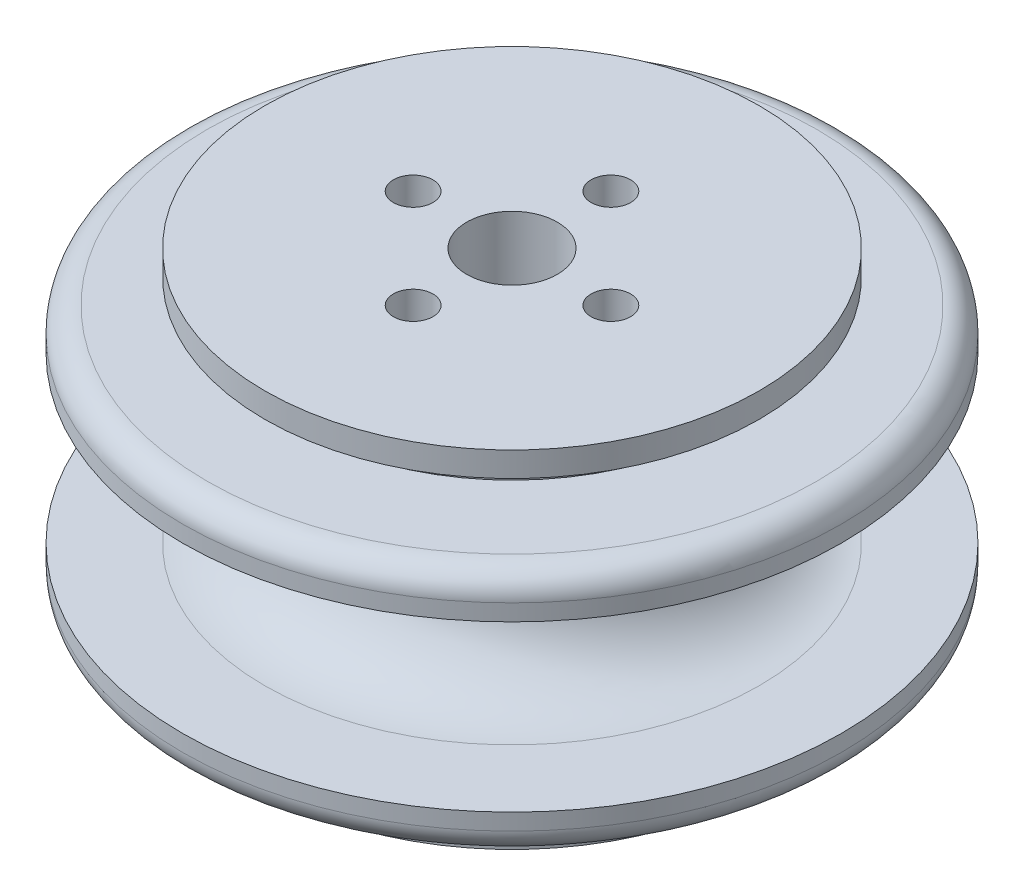
ISO-10303-21;
HEADER;
FILE_DESCRIPTION(('STEP AP214'),'2;1');
FILE_NAME('part.step','',(''),(''),'','','');
FILE_SCHEMA(('AUTOMOTIVE_DESIGN { 1 0 10303 214 1 1 1 1 }'));
ENDSEC;
DATA;
#1=APPLICATION_CONTEXT('core data for automotive mechanical design processes');
#2=APPLICATION_PROTOCOL_DEFINITION('international standard','automotive_design',2000,#1);
#3=PRODUCT_CONTEXT('',#1,'mechanical');
#4=PRODUCT('Part','Part','',(#3));
#5=PRODUCT_RELATED_PRODUCT_CATEGORY('part','',(#4));
#6=PRODUCT_DEFINITION_FORMATION('','',#4);
#7=PRODUCT_DEFINITION_CONTEXT('part definition',#1,'design');
#8=PRODUCT_DEFINITION('design','',#6,#7);
#9=PRODUCT_DEFINITION_SHAPE('','',#8);
#10=(LENGTH_UNIT() NAMED_UNIT(*) SI_UNIT(.MILLI.,.METRE.));
#11=(NAMED_UNIT(*) PLANE_ANGLE_UNIT() SI_UNIT($,.RADIAN.));
#12=(NAMED_UNIT(*) SI_UNIT($,.STERADIAN.) SOLID_ANGLE_UNIT());
#13=UNCERTAINTY_MEASURE_WITH_UNIT(LENGTH_MEASURE(1.E-05),#10,'distance_accuracy_value','');
#14=(GEOMETRIC_REPRESENTATION_CONTEXT(3) GLOBAL_UNCERTAINTY_ASSIGNED_CONTEXT((#13)) GLOBAL_UNIT_ASSIGNED_CONTEXT((#10,
#11,#12)) REPRESENTATION_CONTEXT('',''));
#15=CARTESIAN_POINT('',(0.,0.,0.));
#16=DIRECTION('',(0.,0.,1.));
#17=DIRECTION('',(1.,0.,0.));
#18=AXIS2_PLACEMENT_3D('',#15,#16,#17);
#19=CARTESIAN_POINT('',(0.,30.,0.));
#20=DIRECTION('',(0.,-1.,0.));
#21=DIRECTION('',(0.,0.,-1.));
#22=AXIS2_PLACEMENT_3D('',#19,#20,#21);
#23=CYLINDRICAL_SURFACE('',#22,40.);
#24=CARTESIAN_POINT('',(0.,3.,0.));
#25=DIRECTION('',(0.,1.,0.));
#26=DIRECTION('',(0.,0.,1.));
#27=AXIS2_PLACEMENT_3D('',#24,#25,#26);
#28=CIRCLE('',#27,40.);
#29=CARTESIAN_POINT('',(0.,3.,40.));
#30=VERTEX_POINT('',#29);
#31=EDGE_CURVE('E69',#30,#30,#28,.T.);
#32=ORIENTED_EDGE('',*,*,#31,.T.);
#33=EDGE_LOOP('',(#32));
#34=FACE_BOUND('',#33,.T.);
#35=CARTESIAN_POINT('',(0.,5.00000000000012,0.));
#36=DIRECTION('',(0.,-1.,0.));
#37=DIRECTION('',(1.,0.,0.));
#38=AXIS2_PLACEMENT_3D('',#35,#36,#37);
#39=CIRCLE('',#38,40.);
#40=CARTESIAN_POINT('',(40.,5.00000000000025,0.));
#41=VERTEX_POINT('',#40);
#42=EDGE_CURVE('E126',#41,#41,#39,.T.);
#43=ORIENTED_EDGE('',*,*,#42,.T.);
#44=EDGE_LOOP('',(#43));
#45=FACE_BOUND('',#44,.T.);
#46=ADVANCED_FACE('F51',(#34,#45),#23,.T.);
#47=CARTESIAN_POINT('',(0.,0.,0.));
#48=DIRECTION('',(0.,1.,0.));
#49=DIRECTION('',(0.,0.,1.));
#50=AXIS2_PLACEMENT_3D('',#47,#48,#49);
#51=PLANE('',#50);
#52=CARTESIAN_POINT('',(0.,0.,0.));
#53=DIRECTION('',(0.,1.,0.));
#54=DIRECTION('',(0.,0.,1.));
#55=AXIS2_PLACEMENT_3D('',#52,#53,#54);
#56=CIRCLE('',#55,37.);
#57=CARTESIAN_POINT('',(0.,0.,37.));
#58=VERTEX_POINT('',#57);
#59=EDGE_CURVE('E64',#58,#58,#56,.F.);
#60=ORIENTED_EDGE('',*,*,#59,.T.);
#61=EDGE_LOOP('',(#60));
#62=FACE_BOUND('',#61,.T.);
#63=CARTESIAN_POINT('',(0.,0.,0.));
#64=DIRECTION('',(0.,1.,0.));
#65=DIRECTION('',(0.,0.,1.));
#66=AXIS2_PLACEMENT_3D('',#63,#64,#65);
#67=CIRCLE('',#66,26.);
#68=CARTESIAN_POINT('',(0.,0.,26.));
#69=VERTEX_POINT('',#68);
#70=EDGE_CURVE('E114',#69,#69,#67,.T.);
#71=ORIENTED_EDGE('',*,*,#70,.T.);
#72=EDGE_LOOP('',(#71));
#73=FACE_BOUND('',#72,.T.);
#74=ADVANCED_FACE('F209',(#62,#73),#51,.F.);
#75=CARTESIAN_POINT('',(0.,-3.,0.));
#76=DIRECTION('',(0.,1.,0.));
#77=DIRECTION('',(0.,0.,1.));
#78=AXIS2_PLACEMENT_3D('',#75,#76,#77);
#79=CYLINDRICAL_SURFACE('',#78,26.);
#80=CARTESIAN_POINT('',(0.,-2.,0.));
#81=DIRECTION('',(0.,-1.,0.));
#82=DIRECTION('',(0.,0.,-1.));
#83=AXIS2_PLACEMENT_3D('',#80,#81,#82);
#84=CIRCLE('',#83,26.);
#85=CARTESIAN_POINT('',(0.,-2.,-26.));
#86=VERTEX_POINT('',#85);
#87=EDGE_CURVE('E93',#86,#86,#84,.F.);
#88=ORIENTED_EDGE('',*,*,#87,.T.);
#89=EDGE_LOOP('',(#88));
#90=FACE_BOUND('',#89,.T.);
#91=ORIENTED_EDGE('',*,*,#70,.F.);
#92=EDGE_LOOP('',(#91));
#93=FACE_BOUND('',#92,.T.);
#94=ADVANCED_FACE('F217',(#90,#93),#79,.T.);
#95=CARTESIAN_POINT('',(0.,-6.,0.));
#96=DIRECTION('',(0.,1.,0.));
#97=DIRECTION('',(0.,0.,1.));
#98=AXIS2_PLACEMENT_3D('',#95,#96,#97);
#99=CYLINDRICAL_SURFACE('',#98,30.);
#100=CARTESIAN_POINT('',(0.,-6.,0.));
#101=DIRECTION('',(0.,1.,0.));
#102=DIRECTION('',(0.,0.,1.));
#103=AXIS2_PLACEMENT_3D('',#100,#101,#102);
#104=CIRCLE('',#103,30.);
#105=CARTESIAN_POINT('',(0.,-6.,30.));
#106=VERTEX_POINT('',#105);
#107=EDGE_CURVE('E121',#106,#106,#104,.T.);
#108=ORIENTED_EDGE('',*,*,#107,.T.);
#109=EDGE_LOOP('',(#108));
#110=FACE_BOUND('',#109,.T.);
#111=CARTESIAN_POINT('',(0.,-3.,0.));
#112=DIRECTION('',(0.,1.,0.));
#113=DIRECTION('',(0.,0.,1.));
#114=AXIS2_PLACEMENT_3D('',#111,#112,#113);
#115=CIRCLE('',#114,30.);
#116=CARTESIAN_POINT('',(0.,-3.,30.));
#117=VERTEX_POINT('',#116);
#118=EDGE_CURVE('E122',#117,#117,#115,.T.);
#119=ORIENTED_EDGE('',*,*,#118,.F.);
#120=EDGE_LOOP('',(#119));
#121=FACE_BOUND('',#120,.T.);
#122=ADVANCED_FACE('F254',(#110,#121),#99,.T.);
#123=CARTESIAN_POINT('',(0.,-6.,0.));
#124=DIRECTION('',(0.,-1.,0.));
#125=DIRECTION('',(0.,0.,1.));
#126=AXIS2_PLACEMENT_3D('',#123,#124,#125);
#127=PLANE('',#126);
#128=CARTESIAN_POINT('',(0.,-6.00000000000001,-12.));
#129=DIRECTION('',(0.,1.,0.));
#130=DIRECTION('',(0.,0.,1.));
#131=AXIS2_PLACEMENT_3D('',#128,#129,#130);
#132=CIRCLE('',#131,2.4);
#133=CARTESIAN_POINT('',(0.,-6.00000000000001,-9.6));
#134=VERTEX_POINT('',#133);
#135=EDGE_CURVE('E153',#134,#134,#132,.T.);
#136=ORIENTED_EDGE('',*,*,#135,.T.);
#137=EDGE_LOOP('',(#136));
#138=FACE_BOUND('',#137,.T.);
#139=CARTESIAN_POINT('',(12.,-6.00000000000001,0.));
#140=DIRECTION('',(0.,1.,0.));
#141=DIRECTION('',(0.,0.,1.));
#142=AXIS2_PLACEMENT_3D('',#139,#140,#141);
#143=CIRCLE('',#142,2.4);
#144=CARTESIAN_POINT('',(12.,-6.00000000000001,2.40000000000004));
#145=VERTEX_POINT('',#144);
#146=EDGE_CURVE('E144',#145,#145,#143,.T.);
#147=ORIENTED_EDGE('',*,*,#146,.T.);
#148=EDGE_LOOP('',(#147));
#149=FACE_BOUND('',#148,.T.);
#150=CARTESIAN_POINT('',(-12.,-6.00000000000001,-1.25693328198353E-13));
#151=DIRECTION('',(0.,1.,0.));
#152=DIRECTION('',(0.,0.,1.));
#153=AXIS2_PLACEMENT_3D('',#150,#151,#152);
#154=CIRCLE('',#153,2.4);
#155=CARTESIAN_POINT('',(-12.,-6.00000000000001,2.39999999999987));
#156=VERTEX_POINT('',#155);
#157=EDGE_CURVE('E168',#156,#156,#154,.T.);
#158=ORIENTED_EDGE('',*,*,#157,.T.);
#159=EDGE_LOOP('',(#158));
#160=FACE_BOUND('',#159,.T.);
#161=CARTESIAN_POINT('',(0.,-6.00000000000001,12.));
#162=DIRECTION('',(0.,1.,0.));
#163=DIRECTION('',(0.,0.,1.));
#164=AXIS2_PLACEMENT_3D('',#161,#162,#163);
#165=CIRCLE('',#164,2.4);
#166=CARTESIAN_POINT('',(0.,-6.00000000000001,14.4));
#167=VERTEX_POINT('',#166);
#168=EDGE_CURVE('E160',#167,#167,#165,.T.);
#169=ORIENTED_EDGE('',*,*,#168,.T.);
#170=EDGE_LOOP('',(#169));
#171=FACE_BOUND('',#170,.T.);
#172=CARTESIAN_POINT('',(0.,-6.00000000000001,0.));
#173=DIRECTION('',(0.,1.,0.));
#174=DIRECTION('',(0.,0.,1.));
#175=AXIS2_PLACEMENT_3D('',#172,#173,#174);
#176=CIRCLE('',#175,5.5);
#177=CARTESIAN_POINT('',(0.,-6.00000000000001,5.5));
#178=VERTEX_POINT('',#177);
#179=EDGE_CURVE('E81',#178,#178,#176,.T.);
#180=ORIENTED_EDGE('',*,*,#179,.T.);
#181=EDGE_LOOP('',(#180));
#182=FACE_BOUND('',#181,.T.);
#183=ORIENTED_EDGE('',*,*,#107,.F.);
#184=EDGE_LOOP('',(#183));
#185=FACE_BOUND('',#184,.T.);
#186=ADVANCED_FACE('F250',(#138,#149,#160,#171,#182,#185),#127,.T.);
#187=CARTESIAN_POINT('',(0.,-3.,0.));
#188=DIRECTION('',(0.,-1.,0.));
#189=DIRECTION('',(0.,0.,1.));
#190=AXIS2_PLACEMENT_3D('',#187,#188,#189);
#191=PLANE('',#190);
#192=CARTESIAN_POINT('',(0.,-3.,0.));
#193=DIRECTION('',(0.,-1.,0.));
#194=DIRECTION('',(0.,0.,-1.));
#195=AXIS2_PLACEMENT_3D('',#192,#193,#194);
#196=CIRCLE('',#195,27.);
#197=CARTESIAN_POINT('',(0.,-3.,-27.));
#198=VERTEX_POINT('',#197);
#199=EDGE_CURVE('E89',#198,#198,#196,.T.);
#200=ORIENTED_EDGE('',*,*,#199,.T.);
#201=EDGE_LOOP('',(#200));
#202=FACE_BOUND('',#201,.T.);
#203=ORIENTED_EDGE('',*,*,#118,.T.);
#204=EDGE_LOOP('',(#203));
#205=FACE_BOUND('',#204,.T.);
#206=ADVANCED_FACE('F253',(#202,#205),#191,.F.);
#207=CARTESIAN_POINT('',(0.,-2.,0.));
#208=DIRECTION('',(0.,-1.,0.));
#209=DIRECTION('',(0.,0.,-1.));
#210=AXIS2_PLACEMENT_3D('',#207,#208,#209);
#211=TOROIDAL_SURFACE('',#210,27.,1.);
#212=ORIENTED_EDGE('',*,*,#199,.F.);
#213=EDGE_LOOP('',(#212));
#214=FACE_BOUND('',#213,.T.);
#215=ORIENTED_EDGE('',*,*,#87,.F.);
#216=EDGE_LOOP('',(#215));
#217=FACE_BOUND('',#216,.T.);
#218=ADVANCED_FACE('F243',(#214,#217),#211,.F.);
#219=CARTESIAN_POINT('',(-40.,4.99999999999996,0.));
#220=DIRECTION('',(0.,1.,0.));
#221=DIRECTION('',(-1.,0.,0.));
#222=AXIS2_PLACEMENT_3D('',#219,#220,#221);
#223=PLANE('',#222);
#224=CARTESIAN_POINT('',(0.,5.0000000000001,0.));
#225=DIRECTION('',(0.,1.,0.));
#226=DIRECTION('',(-1.,0.,0.));
#227=AXIS2_PLACEMENT_3D('',#224,#225,#226);
#228=CIRCLE('',#227,30.);
#229=CARTESIAN_POINT('',(-30.,5.,0.));
#230=VERTEX_POINT('',#229);
#231=EDGE_CURVE('E85',#230,#230,#228,.F.);
#232=ORIENTED_EDGE('',*,*,#231,.T.);
#233=EDGE_LOOP('',(#232));
#234=FACE_BOUND('',#233,.T.);
#235=ORIENTED_EDGE('',*,*,#42,.F.);
#236=EDGE_LOOP('',(#235));
#237=FACE_BOUND('',#236,.T.);
#238=ADVANCED_FACE('F237',(#234,#237),#223,.T.);
#239=CARTESIAN_POINT('',(-40.,25.,0.));
#240=DIRECTION('',(0.,-1.,0.));
#241=DIRECTION('',(1.,0.,0.));
#242=AXIS2_PLACEMENT_3D('',#239,#240,#241);
#243=PLANE('',#242);
#244=CARTESIAN_POINT('',(0.,25.0000000000001,0.));
#245=DIRECTION('',(0.,-1.,0.));
#246=DIRECTION('',(1.,0.,0.));
#247=AXIS2_PLACEMENT_3D('',#244,#245,#246);
#248=CIRCLE('',#247,30.);
#249=CARTESIAN_POINT('',(29.9999999999999,25.0000000000002,0.));
#250=VERTEX_POINT('',#249);
#251=EDGE_CURVE('E75',#250,#250,#248,.F.);
#252=ORIENTED_EDGE('',*,*,#251,.T.);
#253=EDGE_LOOP('',(#252));
#254=FACE_BOUND('',#253,.T.);
#255=CARTESIAN_POINT('',(0.,25.0000000000001,0.));
#256=DIRECTION('',(0.,-1.,0.));
#257=DIRECTION('',(1.,0.,0.));
#258=AXIS2_PLACEMENT_3D('',#255,#256,#257);
#259=CIRCLE('',#258,39.9999999999999);
#260=CARTESIAN_POINT('',(39.9999999999998,25.0000000000003,0.));
#261=VERTEX_POINT('',#260);
#262=EDGE_CURVE('E80',#261,#261,#259,.T.);
#263=ORIENTED_EDGE('',*,*,#262,.T.);
#264=EDGE_LOOP('',(#263));
#265=FACE_BOUND('',#264,.T.);
#266=ADVANCED_FACE('F182',(#254,#265),#243,.T.);
#267=CARTESIAN_POINT('',(0.,36.,0.));
#268=DIRECTION('',(0.,1.,0.));
#269=DIRECTION('',(0.,0.,1.));
#270=AXIS2_PLACEMENT_3D('',#267,#268,#269);
#271=PLANE('',#270);
#272=CARTESIAN_POINT('',(0.,36.,-12.));
#273=DIRECTION('',(0.,1.,0.));
#274=DIRECTION('',(0.,0.,1.));
#275=AXIS2_PLACEMENT_3D('',#272,#273,#274);
#276=CIRCLE('',#275,2.4);
#277=CARTESIAN_POINT('',(0.,36.,-9.6));
#278=VERTEX_POINT('',#277);
#279=EDGE_CURVE('E140',#278,#278,#276,.T.);
#280=ORIENTED_EDGE('',*,*,#279,.F.);
#281=EDGE_LOOP('',(#280));
#282=FACE_BOUND('',#281,.T.);
#283=CARTESIAN_POINT('',(12.,36.,0.));
#284=DIRECTION('',(0.,1.,0.));
#285=DIRECTION('',(0.,0.,1.));
#286=AXIS2_PLACEMENT_3D('',#283,#284,#285);
#287=CIRCLE('',#286,2.4);
#288=CARTESIAN_POINT('',(12.,36.,2.40000000000004));
#289=VERTEX_POINT('',#288);
#290=EDGE_CURVE('E148',#289,#289,#287,.T.);
#291=ORIENTED_EDGE('',*,*,#290,.F.);
#292=EDGE_LOOP('',(#291));
#293=FACE_BOUND('',#292,.T.);
#294=CARTESIAN_POINT('',(-12.,36.,-1.25693328198353E-13));
#295=DIRECTION('',(0.,1.,0.));
#296=DIRECTION('',(0.,0.,1.));
#297=AXIS2_PLACEMENT_3D('',#294,#295,#296);
#298=CIRCLE('',#297,2.4);
#299=CARTESIAN_POINT('',(-12.,36.,2.39999999999987));
#300=VERTEX_POINT('',#299);
#301=EDGE_CURVE('E149',#300,#300,#298,.T.);
#302=ORIENTED_EDGE('',*,*,#301,.F.);
#303=EDGE_LOOP('',(#302));
#304=FACE_BOUND('',#303,.T.);
#305=CARTESIAN_POINT('',(0.,36.,12.));
#306=DIRECTION('',(0.,1.,0.));
#307=DIRECTION('',(0.,0.,1.));
#308=AXIS2_PLACEMENT_3D('',#305,#306,#307);
#309=CIRCLE('',#308,2.4);
#310=CARTESIAN_POINT('',(0.,36.,14.4));
#311=VERTEX_POINT('',#310);
#312=EDGE_CURVE('E164',#311,#311,#309,.T.);
#313=ORIENTED_EDGE('',*,*,#312,.F.);
#314=EDGE_LOOP('',(#313));
#315=FACE_BOUND('',#314,.T.);
#316=CARTESIAN_POINT('',(0.,36.,0.));
#317=DIRECTION('',(0.,1.,0.));
#318=DIRECTION('',(0.,0.,1.));
#319=AXIS2_PLACEMENT_3D('',#316,#317,#318);
#320=CIRCLE('',#319,5.5);
#321=CARTESIAN_POINT('',(0.,36.,5.5));
#322=VERTEX_POINT('',#321);
#323=EDGE_CURVE('E136',#322,#322,#320,.T.);
#324=ORIENTED_EDGE('',*,*,#323,.F.);
#325=EDGE_LOOP('',(#324));
#326=FACE_BOUND('',#325,.T.);
#327=CARTESIAN_POINT('',(0.,36.,0.));
#328=DIRECTION('',(0.,1.,0.));
#329=DIRECTION('',(0.,0.,1.));
#330=AXIS2_PLACEMENT_3D('',#327,#328,#329);
#331=CIRCLE('',#330,30.);
#332=CARTESIAN_POINT('',(0.,36.,30.));
#333=VERTEX_POINT('',#332);
#334=EDGE_CURVE('E109',#333,#333,#331,.T.);
#335=ORIENTED_EDGE('',*,*,#334,.T.);
#336=EDGE_LOOP('',(#335));
#337=FACE_BOUND('',#336,.T.);
#338=ADVANCED_FACE('F178',(#282,#293,#304,#315,#326,#337),#271,.T.);
#339=CARTESIAN_POINT('',(0.,36.,0.));
#340=DIRECTION('',(0.,-1.,0.));
#341=DIRECTION('',(0.,0.,-1.));
#342=AXIS2_PLACEMENT_3D('',#339,#340,#341);
#343=CYLINDRICAL_SURFACE('',#342,30.);
#344=ORIENTED_EDGE('',*,*,#334,.F.);
#345=EDGE_LOOP('',(#344));
#346=FACE_BOUND('',#345,.T.);
#347=CARTESIAN_POINT('',(0.,33.,0.));
#348=DIRECTION('',(0.,1.,0.));
#349=DIRECTION('',(0.,0.,1.));
#350=AXIS2_PLACEMENT_3D('',#347,#348,#349);
#351=CIRCLE('',#350,30.);
#352=CARTESIAN_POINT('',(0.,33.,30.));
#353=VERTEX_POINT('',#352);
#354=EDGE_CURVE('E110',#353,#353,#351,.T.);
#355=ORIENTED_EDGE('',*,*,#354,.T.);
#356=EDGE_LOOP('',(#355));
#357=FACE_BOUND('',#356,.T.);
#358=ADVANCED_FACE('F181',(#346,#357),#343,.T.);
#359=CARTESIAN_POINT('',(0.,33.,0.));
#360=DIRECTION('',(0.,1.,0.));
#361=DIRECTION('',(0.,0.,1.));
#362=AXIS2_PLACEMENT_3D('',#359,#360,#361);
#363=PLANE('',#362);
#364=CARTESIAN_POINT('',(0.,33.,0.));
#365=DIRECTION('',(0.,1.,0.));
#366=DIRECTION('',(0.,0.,1.));
#367=AXIS2_PLACEMENT_3D('',#364,#365,#366);
#368=CIRCLE('',#367,27.);
#369=CARTESIAN_POINT('',(0.,33.,27.));
#370=VERTEX_POINT('',#369);
#371=EDGE_CURVE('E101',#370,#370,#368,.T.);
#372=ORIENTED_EDGE('',*,*,#371,.T.);
#373=EDGE_LOOP('',(#372));
#374=FACE_BOUND('',#373,.T.);
#375=ORIENTED_EDGE('',*,*,#354,.F.);
#376=EDGE_LOOP('',(#375));
#377=FACE_BOUND('',#376,.T.);
#378=ADVANCED_FACE('F193',(#374,#377),#363,.F.);
#379=CARTESIAN_POINT('',(0.,32.,0.));
#380=DIRECTION('',(0.,1.,0.));
#381=DIRECTION('',(0.,0.,1.));
#382=AXIS2_PLACEMENT_3D('',#379,#380,#381);
#383=TOROIDAL_SURFACE('',#382,27.,1.);
#384=CARTESIAN_POINT('',(0.,32.,0.));
#385=DIRECTION('',(0.,1.,0.));
#386=DIRECTION('',(0.,0.,1.));
#387=AXIS2_PLACEMENT_3D('',#384,#385,#386);
#388=CIRCLE('',#387,26.);
#389=CARTESIAN_POINT('',(0.,32.,26.));
#390=VERTEX_POINT('',#389);
#391=EDGE_CURVE('E97',#390,#390,#388,.F.);
#392=ORIENTED_EDGE('',*,*,#391,.F.);
#393=EDGE_LOOP('',(#392));
#394=FACE_BOUND('',#393,.T.);
#395=ORIENTED_EDGE('',*,*,#371,.F.);
#396=EDGE_LOOP('',(#395));
#397=FACE_BOUND('',#396,.T.);
#398=ADVANCED_FACE('F198',(#394,#397),#383,.F.);
#399=CARTESIAN_POINT('',(0.,33.,0.));
#400=DIRECTION('',(0.,-1.,0.));
#401=DIRECTION('',(0.,0.,-1.));
#402=AXIS2_PLACEMENT_3D('',#399,#400,#401);
#403=CYLINDRICAL_SURFACE('',#402,26.);
#404=ORIENTED_EDGE('',*,*,#391,.T.);
#405=EDGE_LOOP('',(#404));
#406=FACE_BOUND('',#405,.T.);
#407=CARTESIAN_POINT('',(0.,30.,0.));
#408=DIRECTION('',(0.,1.,0.));
#409=DIRECTION('',(0.,0.,1.));
#410=AXIS2_PLACEMENT_3D('',#407,#408,#409);
#411=CIRCLE('',#410,26.);
#412=CARTESIAN_POINT('',(0.,30.,26.));
#413=VERTEX_POINT('',#412);
#414=EDGE_CURVE('E105',#413,#413,#411,.T.);
#415=ORIENTED_EDGE('',*,*,#414,.T.);
#416=EDGE_LOOP('',(#415));
#417=FACE_BOUND('',#416,.T.);
#418=ADVANCED_FACE('F205',(#406,#417),#403,.T.);
#419=CARTESIAN_POINT('',(0.,30.,0.));
#420=DIRECTION('',(0.,1.,0.));
#421=DIRECTION('',(0.,0.,1.));
#422=AXIS2_PLACEMENT_3D('',#419,#420,#421);
#423=PLANE('',#422);
#424=CARTESIAN_POINT('',(0.,30.,0.));
#425=DIRECTION('',(0.,1.,0.));
#426=DIRECTION('',(0.,0.,1.));
#427=AXIS2_PLACEMENT_3D('',#424,#425,#426);
#428=CIRCLE('',#427,37.);
#429=CARTESIAN_POINT('',(0.,30.,37.));
#430=VERTEX_POINT('',#429);
#431=EDGE_CURVE('E59',#430,#430,#428,.T.);
#432=ORIENTED_EDGE('',*,*,#431,.T.);
#433=EDGE_LOOP('',(#432));
#434=FACE_BOUND('',#433,.T.);
#435=ORIENTED_EDGE('',*,*,#414,.F.);
#436=EDGE_LOOP('',(#435));
#437=FACE_BOUND('',#436,.T.);
#438=ADVANCED_FACE('F223',(#434,#437),#423,.T.);
#439=CARTESIAN_POINT('',(0.,27.,0.));
#440=DIRECTION('',(0.,1.,0.));
#441=DIRECTION('',(0.,0.,1.));
#442=AXIS2_PLACEMENT_3D('',#439,#440,#441);
#443=CIRCLE('',#442,40.);
#444=CARTESIAN_POINT('',(0.,27.,40.));
#445=VERTEX_POINT('',#444);
#446=EDGE_CURVE('E11',#445,#445,#443,.F.);
#447=ORIENTED_EDGE('',*,*,#446,.T.);
#448=EDGE_LOOP('',(#447));
#449=FACE_BOUND('',#448,.T.);
#450=ORIENTED_EDGE('',*,*,#262,.F.);
#451=EDGE_LOOP('',(#450));
#452=FACE_BOUND('',#451,.T.);
#453=ADVANCED_FACE('F212',(#449,#452),#23,.T.);
#454=CARTESIAN_POINT('',(0.,15.0000000000001,0.));
#455=DIRECTION('',(0.,-1.,0.));
#456=DIRECTION('',(1.,0.,0.));
#457=AXIS2_PLACEMENT_3D('',#454,#455,#456);
#458=TOROIDAL_SURFACE('',#457,30.,10.);
#459=ORIENTED_EDGE('',*,*,#251,.F.);
#460=EDGE_LOOP('',(#459));
#461=FACE_BOUND('',#460,.T.);
#462=CARTESIAN_POINT('',(0.,15.0000000000001,0.));
#463=DIRECTION('',(0.,-1.,0.));
#464=DIRECTION('',(1.,0.,0.));
#465=AXIS2_PLACEMENT_3D('',#462,#463,#464);
#466=CIRCLE('',#465,20.);
#467=CARTESIAN_POINT('',(19.9999999999999,15.0000000000002,0.));
#468=VERTEX_POINT('',#467);
#469=EDGE_CURVE('E76',#468,#468,#466,.T.);
#470=ORIENTED_EDGE('',*,*,#469,.F.);
#471=EDGE_LOOP('',(#470));
#472=FACE_BOUND('',#471,.T.);
#473=ADVANCED_FACE('F222',(#461,#472),#458,.F.);
#474=CARTESIAN_POINT('',(0.,15.0000000000001,0.));
#475=DIRECTION('',(0.,1.,0.));
#476=DIRECTION('',(-1.,0.,0.));
#477=AXIS2_PLACEMENT_3D('',#474,#475,#476);
#478=TOROIDAL_SURFACE('',#477,30.,10.);
#479=ORIENTED_EDGE('',*,*,#469,.T.);
#480=EDGE_LOOP('',(#479));
#481=FACE_BOUND('',#480,.T.);
#482=ORIENTED_EDGE('',*,*,#231,.F.);
#483=EDGE_LOOP('',(#482));
#484=FACE_BOUND('',#483,.T.);
#485=ADVANCED_FACE('F229',(#481,#484),#478,.F.);
#486=CARTESIAN_POINT('',(0.,3.,0.));
#487=DIRECTION('',(0.,1.,0.));
#488=DIRECTION('',(0.,0.,1.));
#489=AXIS2_PLACEMENT_3D('',#486,#487,#488);
#490=TOROIDAL_SURFACE('',#489,37.,3.);
#491=ORIENTED_EDGE('',*,*,#59,.F.);
#492=EDGE_LOOP('',(#491));
#493=FACE_BOUND('',#492,.T.);
#494=ORIENTED_EDGE('',*,*,#31,.F.);
#495=EDGE_LOOP('',(#494));
#496=FACE_BOUND('',#495,.T.);
#497=ADVANCED_FACE('F278',(#493,#496),#490,.T.);
#498=CARTESIAN_POINT('',(0.,27.,0.));
#499=DIRECTION('',(0.,1.,0.));
#500=DIRECTION('',(0.,0.,1.));
#501=AXIS2_PLACEMENT_3D('',#498,#499,#500);
#502=TOROIDAL_SURFACE('',#501,37.,3.);
#503=ORIENTED_EDGE('',*,*,#446,.F.);
#504=EDGE_LOOP('',(#503));
#505=FACE_BOUND('',#504,.T.);
#506=ORIENTED_EDGE('',*,*,#431,.F.);
#507=EDGE_LOOP('',(#506));
#508=FACE_BOUND('',#507,.T.);
#509=ADVANCED_FACE('F53',(#505,#508),#502,.T.);
#510=CARTESIAN_POINT('',(0.,-6.00000000000001,0.));
#511=DIRECTION('',(0.,1.,0.));
#512=DIRECTION('',(0.,0.,1.));
#513=AXIS2_PLACEMENT_3D('',#510,#511,#512);
#514=CYLINDRICAL_SURFACE('',#513,5.5);
#515=ORIENTED_EDGE('',*,*,#179,.F.);
#516=EDGE_LOOP('',(#515));
#517=FACE_BOUND('',#516,.T.);
#518=ORIENTED_EDGE('',*,*,#323,.T.);
#519=EDGE_LOOP('',(#518));
#520=FACE_BOUND('',#519,.T.);
#521=ADVANCED_FACE('F247',(#517,#520),#514,.F.);
#522=CARTESIAN_POINT('',(0.,-6.00000000000001,12.));
#523=DIRECTION('',(0.,1.,0.));
#524=DIRECTION('',(0.,0.,1.));
#525=AXIS2_PLACEMENT_3D('',#522,#523,#524);
#526=CYLINDRICAL_SURFACE('',#525,2.4);
#527=ORIENTED_EDGE('',*,*,#312,.T.);
#528=EDGE_LOOP('',(#527));
#529=FACE_BOUND('',#528,.T.);
#530=ORIENTED_EDGE('',*,*,#168,.F.);
#531=EDGE_LOOP('',(#530));
#532=FACE_BOUND('',#531,.T.);
#533=ADVANCED_FACE('F291',(#529,#532),#526,.F.);
#534=CARTESIAN_POINT('',(-12.,-6.00000000000001,-1.25693328198353E-13));
#535=DIRECTION('',(0.,1.,0.));
#536=DIRECTION('',(0.,0.,1.));
#537=AXIS2_PLACEMENT_3D('',#534,#535,#536);
#538=CYLINDRICAL_SURFACE('',#537,2.4);
#539=ORIENTED_EDGE('',*,*,#157,.F.);
#540=EDGE_LOOP('',(#539));
#541=FACE_BOUND('',#540,.T.);
#542=ORIENTED_EDGE('',*,*,#301,.T.);
#543=EDGE_LOOP('',(#542));
#544=FACE_BOUND('',#543,.T.);
#545=ADVANCED_FACE('F176',(#541,#544),#538,.F.);
#546=CARTESIAN_POINT('',(12.,-6.00000000000001,0.));
#547=DIRECTION('',(0.,1.,0.));
#548=DIRECTION('',(0.,0.,1.));
#549=AXIS2_PLACEMENT_3D('',#546,#547,#548);
#550=CYLINDRICAL_SURFACE('',#549,2.4);
#551=ORIENTED_EDGE('',*,*,#146,.F.);
#552=EDGE_LOOP('',(#551));
#553=FACE_BOUND('',#552,.T.);
#554=ORIENTED_EDGE('',*,*,#290,.T.);
#555=EDGE_LOOP('',(#554));
#556=FACE_BOUND('',#555,.T.);
#557=ADVANCED_FACE('F310',(#553,#556),#550,.F.);
#558=CARTESIAN_POINT('',(0.,-6.00000000000001,-12.));
#559=DIRECTION('',(0.,1.,0.));
#560=DIRECTION('',(0.,0.,1.));
#561=AXIS2_PLACEMENT_3D('',#558,#559,#560);
#562=CYLINDRICAL_SURFACE('',#561,2.4);
#563=ORIENTED_EDGE('',*,*,#135,.F.);
#564=EDGE_LOOP('',(#563));
#565=FACE_BOUND('',#564,.T.);
#566=ORIENTED_EDGE('',*,*,#279,.T.);
#567=EDGE_LOOP('',(#566));
#568=FACE_BOUND('',#567,.T.);
#569=ADVANCED_FACE('F315',(#565,#568),#562,.F.);
#570=CLOSED_SHELL('',(#46,#74,#94,#122,#186,#206,#218,#238,#266,#338,#358,#378,#398,#418,#438,
#453,#473,#485,#497,#509,#521,#533,#545,#557,#569));
#571=MANIFOLD_SOLID_BREP('B2',#570);
#572=ADVANCED_BREP_SHAPE_REPRESENTATION('',(#18,#571),#14);
#573=SHAPE_DEFINITION_REPRESENTATION(#9,#572);
ENDSEC;
END-ISO-10303-21;
